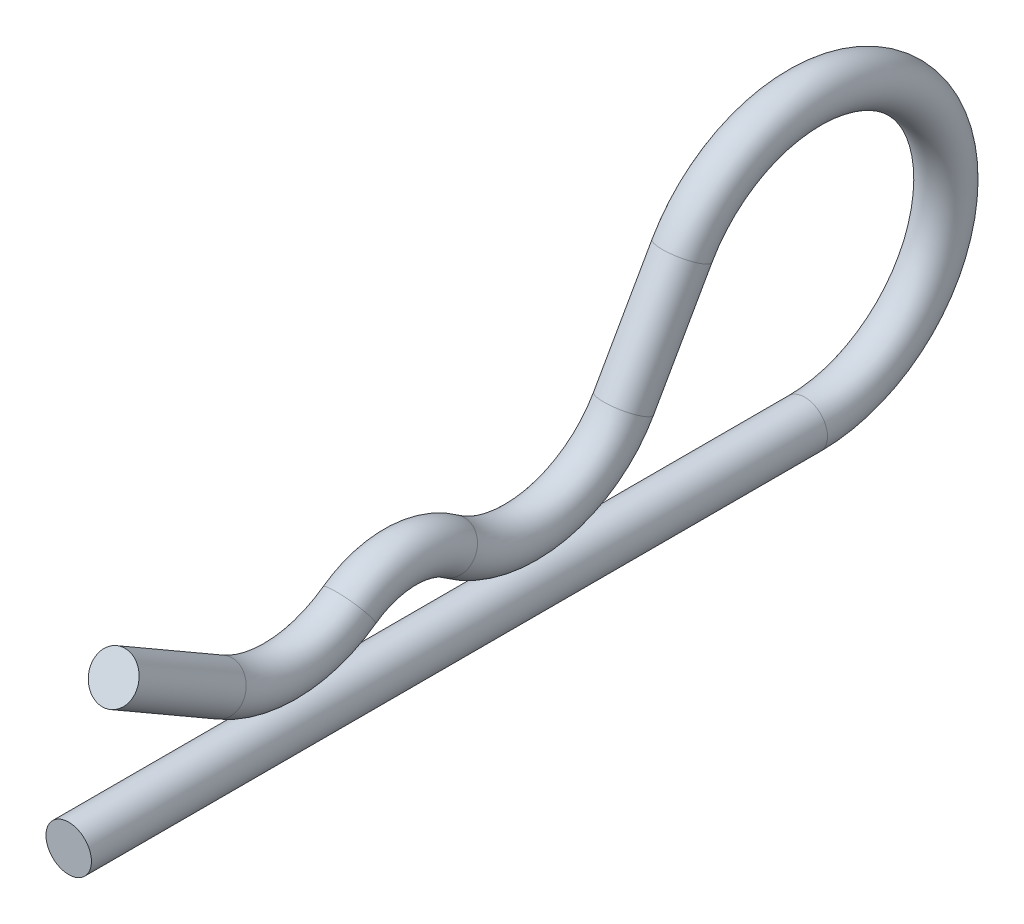
ISO-10303-21;
HEADER;
FILE_DESCRIPTION(('STEP AP214'),'2;1');
FILE_NAME('part.step','',(''),(''),'','','');
FILE_SCHEMA(('AUTOMOTIVE_DESIGN { 1 0 10303 214 1 1 1 1 }'));
ENDSEC;
DATA;
#1=APPLICATION_CONTEXT('core data for automotive mechanical design processes');
#2=APPLICATION_PROTOCOL_DEFINITION('international standard','automotive_design',2000,#1);
#3=PRODUCT_CONTEXT('',#1,'mechanical');
#4=PRODUCT('Part','Part','',(#3));
#5=PRODUCT_RELATED_PRODUCT_CATEGORY('part','',(#4));
#6=PRODUCT_DEFINITION_FORMATION('','',#4);
#7=PRODUCT_DEFINITION_CONTEXT('part definition',#1,'design');
#8=PRODUCT_DEFINITION('design','',#6,#7);
#9=PRODUCT_DEFINITION_SHAPE('','',#8);
#10=(LENGTH_UNIT() NAMED_UNIT(*) SI_UNIT(.MILLI.,.METRE.));
#11=(NAMED_UNIT(*) PLANE_ANGLE_UNIT() SI_UNIT($,.RADIAN.));
#12=(NAMED_UNIT(*) SI_UNIT($,.STERADIAN.) SOLID_ANGLE_UNIT());
#13=UNCERTAINTY_MEASURE_WITH_UNIT(LENGTH_MEASURE(1.E-05),#10,'distance_accuracy_value','');
#14=(GEOMETRIC_REPRESENTATION_CONTEXT(3) GLOBAL_UNCERTAINTY_ASSIGNED_CONTEXT((#13)) GLOBAL_UNIT_ASSIGNED_CONTEXT((#10,
#11,#12)) REPRESENTATION_CONTEXT('',''));
#15=CARTESIAN_POINT('',(0.,0.,0.));
#16=DIRECTION('',(0.,0.,1.));
#17=DIRECTION('',(1.,0.,0.));
#18=AXIS2_PLACEMENT_3D('',#15,#16,#17);
#19=CARTESIAN_POINT('',(0.,0.,24.66975));
#20=DIRECTION('',(0.,0.,1.));
#21=DIRECTION('',(1.,0.,0.));
#22=AXIS2_PLACEMENT_3D('',#19,#20,#21);
#23=PLANE('',#22);
#24=CARTESIAN_POINT('',(0.,0.,24.66975));
#25=DIRECTION('',(0.,0.,1.));
#26=DIRECTION('',(1.,0.,0.));
#27=AXIS2_PLACEMENT_3D('',#24,#25,#26);
#28=CIRCLE('',#27,1.524);
#29=CARTESIAN_POINT('',(1.524,0.,24.66975));
#30=VERTEX_POINT('',#29);
#31=EDGE_CURVE('E54',#30,#30,#28,.T.);
#32=ORIENTED_EDGE('',*,*,#31,.T.);
#33=EDGE_LOOP('',(#32));
#34=FACE_BOUND('',#33,.T.);
#35=ADVANCED_FACE('F41',(#34),#23,.T.);
#36=CARTESIAN_POINT('',(0.,8.40684706699102,21.6535));
#37=DIRECTION('',(0.,-0.499999999999994,-0.866025403784442));
#38=DIRECTION('',(1.,0.,0.));
#39=AXIS2_PLACEMENT_3D('',#36,#37,#38);
#40=PLANE('',#39);
#41=CARTESIAN_POINT('',(0.,8.40684706699102,21.6535));
#42=DIRECTION('',(0.,-0.499999999999994,-0.866025403784442));
#43=DIRECTION('',(1.,0.,0.));
#44=AXIS2_PLACEMENT_3D('',#41,#42,#43);
#45=CIRCLE('',#44,1.524);
#46=CARTESIAN_POINT('',(1.524,8.40684706699102,21.6535));
#47=VERTEX_POINT('',#46);
#48=EDGE_CURVE('E11',#47,#47,#45,.T.);
#49=ORIENTED_EDGE('',*,*,#48,.F.);
#50=EDGE_LOOP('',(#49));
#51=FACE_BOUND('',#50,.T.);
#52=ADVANCED_FACE('F60',(#51),#40,.F.);
#53=CARTESIAN_POINT('',(0.,0.,24.66975));
#54=DIRECTION('',(0.,0.,-1.));
#55=DIRECTION('',(0.,1.,0.));
#56=AXIS2_PLACEMENT_3D('',#53,#54,#55);
#57=CYLINDRICAL_SURFACE('',#56,1.524);
#58=CARTESIAN_POINT('',(0.,0.,-24.66975));
#59=DIRECTION('',(0.,0.,1.));
#60=DIRECTION('',(1.,0.,0.));
#61=AXIS2_PLACEMENT_3D('',#58,#59,#60);
#62=CIRCLE('',#61,1.524);
#63=CARTESIAN_POINT('',(0.,-1.52399999999998,-24.66975));
#64=VERTEX_POINT('',#63);
#65=EDGE_CURVE('E102',#64,#64,#62,.T.);
#66=ORIENTED_EDGE('',*,*,#65,.T.);
#67=EDGE_LOOP('',(#66));
#68=FACE_BOUND('',#67,.T.);
#69=ORIENTED_EDGE('',*,*,#31,.F.);
#70=EDGE_LOOP('',(#69));
#71=FACE_BOUND('',#70,.T.);
#72=ADVANCED_FACE('F62',(#68,#71),#57,.T.);
#73=CARTESIAN_POINT('',(0.,9.46149999999999,-24.66975));
#74=DIRECTION('',(1.,0.,0.));
#75=DIRECTION('',(0.,0.,-1.));
#76=AXIS2_PLACEMENT_3D('',#73,#74,#75);
#77=TOROIDAL_SURFACE('',#76,9.46149999999998,1.524);
#78=CARTESIAN_POINT('',(0.,14.1279857029118,-16.4390821392174));
#79=DIRECTION('',(0.,0.869911521511666,-0.493207810908605));
#80=DIRECTION('',(1.,0.,0.));
#81=AXIS2_PLACEMENT_3D('',#78,#79,#80);
#82=CIRCLE('',#81,1.524);
#83=CARTESIAN_POINT('',(0.,14.8796344067365,-15.1133369804336));
#84=VERTEX_POINT('',#83);
#85=EDGE_CURVE('E99',#84,#84,#82,.T.);
#86=CARTESIAN_POINT('',(0.,9.46149999999999,-24.66975));
#87=DIRECTION('',(1.,0.,0.));
#88=DIRECTION('',(0.,0.,-1.));
#89=AXIS2_PLACEMENT_3D('',#86,#87,#88);
#90=CIRCLE('',#89,10.9855);
#91=EDGE_CURVE('',#64,#84,#90,.T.);
#92=ORIENTED_EDGE('',*,*,#65,.F.);
#93=ORIENTED_EDGE('',*,*,#85,.T.);
#94=ORIENTED_EDGE('',*,*,#91,.T.);
#95=ORIENTED_EDGE('',*,*,#91,.F.);
#96=EDGE_LOOP('',(#92,#94,#93,#95));
#97=FACE_BOUND('',#96,.T.);
#98=ADVANCED_FACE('F67',(#97),#77,.T.);
#99=CARTESIAN_POINT('',(0.,14.1279857029118,-16.4390821392174));
#100=DIRECTION('',(0.,-0.869911521511664,0.493207810908608));
#101=DIRECTION('',(0.,-0.493207810908608,-0.869911521511664));
#102=AXIS2_PLACEMENT_3D('',#99,#100,#101);
#103=CYLINDRICAL_SURFACE('',#102,1.524);
#104=CARTESIAN_POINT('',(0.,7.22306300091294,-12.5242451401303));
#105=DIRECTION('',(0.,0.869911521511664,-0.493207810908608));
#106=DIRECTION('',(1.,0.,0.));
#107=AXIS2_PLACEMENT_3D('',#104,#105,#106);
#108=CIRCLE('',#107,1.524);
#109=CARTESIAN_POINT('',(0.,6.47141429708823,-13.8499902989141));
#110=VERTEX_POINT('',#109);
#111=EDGE_CURVE('E108',#110,#110,#108,.T.);
#112=ORIENTED_EDGE('',*,*,#111,.T.);
#113=EDGE_LOOP('',(#112));
#114=FACE_BOUND('',#113,.T.);
#115=ORIENTED_EDGE('',*,*,#85,.F.);
#116=EDGE_LOOP('',(#115));
#117=FACE_BOUND('',#116,.T.);
#118=ADVANCED_FACE('F87',(#114,#117),#103,.T.);
#119=CARTESIAN_POINT('',(0.,11.1379,-5.61932243813145));
#120=DIRECTION('',(-1.,0.,0.));
#121=DIRECTION('',(0.,0.,1.));
#122=AXIS2_PLACEMENT_3D('',#119,#120,#121);
#123=TOROIDAL_SURFACE('',#122,7.93749999999999,1.524);
#124=CARTESIAN_POINT('',(0.,4.70862701359261,-0.964394391829111));
#125=DIRECTION('',(0.,-0.58644762788061,-0.809987147893845));
#126=DIRECTION('',(1.,0.,0.));
#127=AXIS2_PLACEMENT_3D('',#124,#125,#126);
#128=CIRCLE('',#127,1.524);
#129=CARTESIAN_POINT('',(0.,3.47420660020239,-0.0706482069390644));
#130=VERTEX_POINT('',#129);
#131=EDGE_CURVE('E115',#130,#130,#128,.T.);
#132=CARTESIAN_POINT('',(0.,11.1379,-5.61932243813145));
#133=DIRECTION('',(-1.,0.,0.));
#134=DIRECTION('',(0.,0.,1.));
#135=AXIS2_PLACEMENT_3D('',#132,#133,#134);
#136=CIRCLE('',#135,9.46149999999999);
#137=EDGE_CURVE('',#110,#130,#136,.T.);
#138=ORIENTED_EDGE('',*,*,#111,.F.);
#139=ORIENTED_EDGE('',*,*,#131,.T.);
#140=ORIENTED_EDGE('',*,*,#137,.T.);
#141=ORIENTED_EDGE('',*,*,#137,.F.);
#142=EDGE_LOOP('',(#138,#140,#139,#141));
#143=FACE_BOUND('',#142,.T.);
#144=ADVANCED_FACE('F83',(#143),#123,.T.);
#145=CARTESIAN_POINT('',(0.,0.,2.44475));
#146=DIRECTION('',(1.,0.,0.));
#147=DIRECTION('',(0.,0.,-1.));
#148=AXIS2_PLACEMENT_3D('',#145,#146,#147);
#149=TOROIDAL_SURFACE('',#148,5.81321200692645,1.524);
#150=CARTESIAN_POINT('',(0.,4.70862701359261,5.8538943918291));
#151=DIRECTION('',(0.,0.586447627880611,-0.809987147893844));
#152=DIRECTION('',(1.,0.,0.));
#153=AXIS2_PLACEMENT_3D('',#150,#151,#152);
#154=CIRCLE('',#153,1.524);
#155=CARTESIAN_POINT('',(0.,3.47420660020239,4.96014820693905));
#156=VERTEX_POINT('',#155);
#157=EDGE_CURVE('E119',#156,#156,#154,.T.);
#158=ORIENTED_EDGE('',*,*,#157,.T.);
#159=EDGE_LOOP('',(#158));
#160=FACE_BOUND('',#159,.T.);
#161=ORIENTED_EDGE('',*,*,#131,.F.);
#162=EDGE_LOOP('',(#161));
#163=FACE_BOUND('',#162,.T.);
#164=ADVANCED_FACE('F77',(#160,#163),#149,.T.);
#165=CARTESIAN_POINT('',(0.,11.1379,10.5088224381315));
#166=DIRECTION('',(-1.,0.,0.));
#167=DIRECTION('',(0.,0.,1.));
#168=AXIS2_PLACEMENT_3D('',#165,#166,#167);
#169=TOROIDAL_SURFACE('',#168,7.9375,1.524);
#170=CARTESIAN_POINT('',(0.,4.26382335746099,14.4775724381314));
#171=DIRECTION('',(0.,-0.499999999999994,-0.866025403784442));
#172=DIRECTION('',(1.,0.,0.));
#173=AXIS2_PLACEMENT_3D('',#170,#171,#172);
#174=CIRCLE('',#173,1.524);
#175=CARTESIAN_POINT('',(0.,2.9440006420935,15.2395724381314));
#176=VERTEX_POINT('',#175);
#177=EDGE_CURVE('E49',#176,#176,#174,.T.);
#178=CARTESIAN_POINT('',(0.,11.1379,10.5088224381315));
#179=DIRECTION('',(-1.,0.,0.));
#180=DIRECTION('',(0.,0.,1.));
#181=AXIS2_PLACEMENT_3D('',#178,#179,#180);
#182=CIRCLE('',#181,9.4615);
#183=EDGE_CURVE('',#156,#176,#182,.T.);
#184=ORIENTED_EDGE('',*,*,#157,.F.);
#185=ORIENTED_EDGE('',*,*,#177,.T.);
#186=ORIENTED_EDGE('',*,*,#183,.T.);
#187=ORIENTED_EDGE('',*,*,#183,.F.);
#188=EDGE_LOOP('',(#184,#186,#185,#187));
#189=FACE_BOUND('',#188,.T.);
#190=ADVANCED_FACE('F73',(#189),#169,.T.);
#191=CARTESIAN_POINT('',(0.,4.26382335746099,14.4775724381314));
#192=DIRECTION('',(0.,0.499999999999994,0.866025403784442));
#193=DIRECTION('',(0.,-0.866025403784442,0.499999999999994));
#194=AXIS2_PLACEMENT_3D('',#191,#192,#193);
#195=CYLINDRICAL_SURFACE('',#194,1.524);
#196=ORIENTED_EDGE('',*,*,#48,.T.);
#197=EDGE_LOOP('',(#196));
#198=FACE_BOUND('',#197,.T.);
#199=ORIENTED_EDGE('',*,*,#177,.F.);
#200=EDGE_LOOP('',(#199));
#201=FACE_BOUND('',#200,.T.);
#202=ADVANCED_FACE('F57',(#198,#201),#195,.T.);
#203=CLOSED_SHELL('',(#35,#52,#72,#98,#118,#144,#164,#190,#202));
#204=MANIFOLD_SOLID_BREP('B2',#203);
#205=ADVANCED_BREP_SHAPE_REPRESENTATION('',(#18,#204),#14);
#206=SHAPE_DEFINITION_REPRESENTATION(#9,#205);
ENDSEC;
END-ISO-10303-21;
